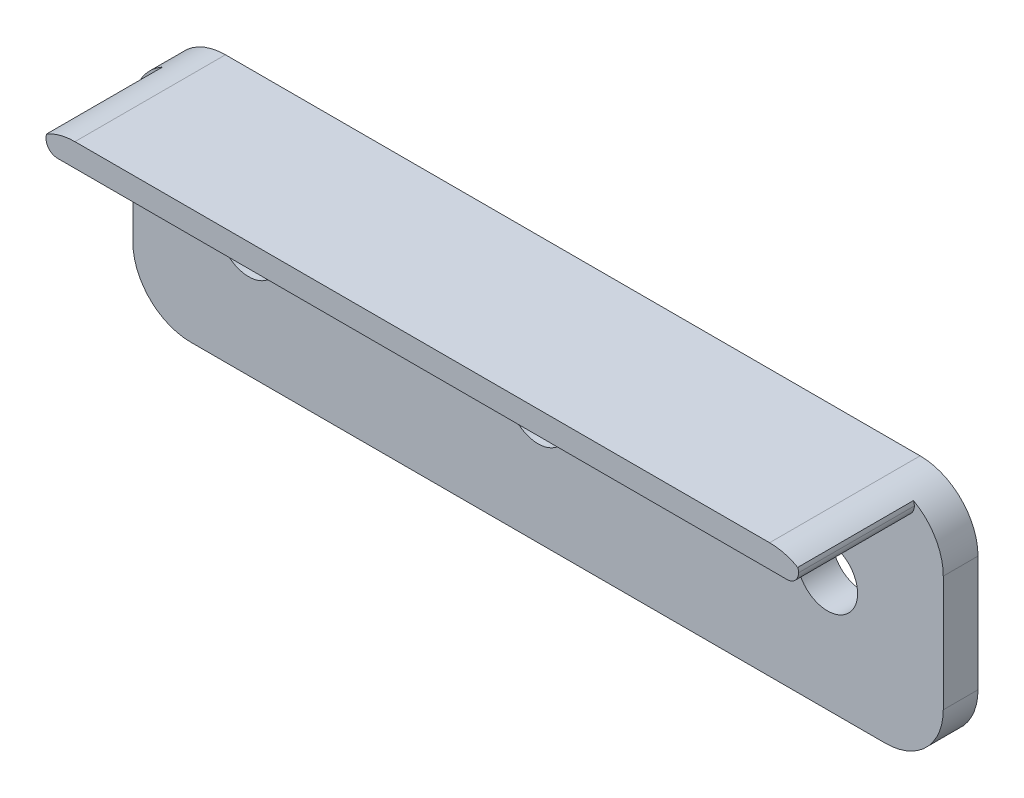
ISO-10303-21;
HEADER;
FILE_DESCRIPTION(('STEP AP214'),'2;1');
FILE_NAME('part.step','',(''),(''),'','','');
FILE_SCHEMA(('AUTOMOTIVE_DESIGN { 1 0 10303 214 1 1 1 1 }'));
ENDSEC;
DATA;
#1=APPLICATION_CONTEXT('core data for automotive mechanical design processes');
#2=APPLICATION_PROTOCOL_DEFINITION('international standard','automotive_design',2000,#1);
#3=PRODUCT_CONTEXT('',#1,'mechanical');
#4=PRODUCT('Part','Part','',(#3));
#5=PRODUCT_RELATED_PRODUCT_CATEGORY('part','',(#4));
#6=PRODUCT_DEFINITION_FORMATION('','',#4);
#7=PRODUCT_DEFINITION_CONTEXT('part definition',#1,'design');
#8=PRODUCT_DEFINITION('design','',#6,#7);
#9=PRODUCT_DEFINITION_SHAPE('','',#8);
#10=(LENGTH_UNIT() NAMED_UNIT(*) SI_UNIT(.MILLI.,.METRE.));
#11=(NAMED_UNIT(*) PLANE_ANGLE_UNIT() SI_UNIT($,.RADIAN.));
#12=(NAMED_UNIT(*) SI_UNIT($,.STERADIAN.) SOLID_ANGLE_UNIT());
#13=UNCERTAINTY_MEASURE_WITH_UNIT(LENGTH_MEASURE(1.E-05),#10,'distance_accuracy_value','');
#14=(GEOMETRIC_REPRESENTATION_CONTEXT(3) GLOBAL_UNCERTAINTY_ASSIGNED_CONTEXT((#13)) GLOBAL_UNIT_ASSIGNED_CONTEXT((#10,
#11,#12)) REPRESENTATION_CONTEXT('',''));
#15=CARTESIAN_POINT('',(0.,0.,0.));
#16=DIRECTION('',(0.,0.,1.));
#17=DIRECTION('',(1.,0.,0.));
#18=AXIS2_PLACEMENT_3D('',#15,#16,#17);
#19=CARTESIAN_POINT('',(0.,0.,3.));
#20=DIRECTION('',(0.,0.,-1.));
#21=DIRECTION('',(-1.,0.,0.));
#22=AXIS2_PLACEMENT_3D('',#19,#20,#21);
#23=PLANE('',#22);
#24=CARTESIAN_POINT('',(0.,0.,3.));
#25=DIRECTION('',(0.,0.,1.));
#26=DIRECTION('',(1.,0.,0.));
#27=AXIS2_PLACEMENT_3D('',#24,#25,#26);
#28=CIRCLE('',#27,2.6);
#29=CARTESIAN_POINT('',(2.6,0.,3.));
#30=VERTEX_POINT('',#29);
#31=EDGE_CURVE('E318',#30,#30,#28,.T.);
#32=ORIENTED_EDGE('',*,*,#31,.F.);
#33=EDGE_LOOP('',(#32));
#34=FACE_BOUND('',#33,.T.);
#35=CARTESIAN_POINT('',(25.,0.,3.));
#36=DIRECTION('',(0.,0.,1.));
#37=DIRECTION('',(1.,0.,0.));
#38=AXIS2_PLACEMENT_3D('',#35,#36,#37);
#39=CIRCLE('',#38,2.6);
#40=CARTESIAN_POINT('',(27.6,0.,3.));
#41=VERTEX_POINT('',#40);
#42=EDGE_CURVE('E326',#41,#41,#39,.T.);
#43=ORIENTED_EDGE('',*,*,#42,.F.);
#44=EDGE_LOOP('',(#43));
#45=FACE_BOUND('',#44,.T.);
#46=CARTESIAN_POINT('',(-25.,0.,3.));
#47=DIRECTION('',(0.,0.,1.));
#48=DIRECTION('',(1.,0.,0.));
#49=AXIS2_PLACEMENT_3D('',#46,#47,#48);
#50=CIRCLE('',#49,2.6);
#51=CARTESIAN_POINT('',(-22.4,0.,3.));
#52=VERTEX_POINT('',#51);
#53=EDGE_CURVE('E263',#52,#52,#50,.T.);
#54=ORIENTED_EDGE('',*,*,#53,.F.);
#55=EDGE_LOOP('',(#54));
#56=FACE_BOUND('',#55,.T.);
#57=DIRECTION('',(0.,-1.,0.));
#58=VECTOR('',#57,1.);
#59=CARTESIAN_POINT('',(-35.,-10.,3.));
#60=LINE('',#59,#58);
#61=CARTESIAN_POINT('',(-35.,5.,3.));
#62=VERTEX_POINT('',#61);
#63=CARTESIAN_POINT('',(-35.,-5.,3.));
#64=VERTEX_POINT('',#63);
#65=EDGE_CURVE('E337',#62,#64,#60,.T.);
#66=ORIENTED_EDGE('',*,*,#65,.T.);
#67=CARTESIAN_POINT('',(-30.,-5.,3.));
#68=DIRECTION('',(0.,0.,-1.));
#69=DIRECTION('',(-1.,0.,0.));
#70=AXIS2_PLACEMENT_3D('',#67,#68,#69);
#71=CIRCLE('',#70,5.);
#72=CARTESIAN_POINT('',(-30.,-10.,3.));
#73=VERTEX_POINT('',#72);
#74=EDGE_CURVE('E221',#64,#73,#71,.F.);
#75=ORIENTED_EDGE('',*,*,#74,.T.);
#76=DIRECTION('',(1.,0.,0.));
#77=VECTOR('',#76,1.);
#78=CARTESIAN_POINT('',(-35.,-10.,3.));
#79=LINE('',#78,#77);
#80=CARTESIAN_POINT('',(30.,-10.,3.));
#81=VERTEX_POINT('',#80);
#82=EDGE_CURVE('E274',#73,#81,#79,.T.);
#83=ORIENTED_EDGE('',*,*,#82,.T.);
#84=CARTESIAN_POINT('',(30.,-5.,3.));
#85=DIRECTION('',(0.,0.,-1.));
#86=DIRECTION('',(-1.,0.,0.));
#87=AXIS2_PLACEMENT_3D('',#84,#85,#86);
#88=CIRCLE('',#87,5.);
#89=CARTESIAN_POINT('',(35.,-5.,3.));
#90=VERTEX_POINT('',#89);
#91=EDGE_CURVE('E215',#81,#90,#88,.F.);
#92=ORIENTED_EDGE('',*,*,#91,.T.);
#93=DIRECTION('',(0.,1.,0.));
#94=VECTOR('',#93,1.);
#95=CARTESIAN_POINT('',(35.,-10.,3.));
#96=LINE('',#95,#94);
#97=CARTESIAN_POINT('',(35.,5.,3.));
#98=VERTEX_POINT('',#97);
#99=EDGE_CURVE('E252',#90,#98,#96,.T.);
#100=ORIENTED_EDGE('',*,*,#99,.T.);
#101=CARTESIAN_POINT('',(30.,5.,3.));
#102=DIRECTION('',(0.,0.,-1.));
#103=DIRECTION('',(-1.,0.,0.));
#104=AXIS2_PLACEMENT_3D('',#101,#102,#103);
#105=CIRCLE('',#104,5.);
#106=CARTESIAN_POINT('',(32.4288616251925,9.3704268905528,3.));
#107=VERTEX_POINT('',#106);
#108=EDGE_CURVE('E212',#98,#107,#105,.F.);
#109=ORIENTED_EDGE('',*,*,#108,.T.);
#110=CARTESIAN_POINT('',(31.5,9.,3.));
#111=DIRECTION('',(0.,0.,-1.));
#112=DIRECTION('',(-1.,0.,0.));
#113=AXIS2_PLACEMENT_3D('',#110,#111,#112);
#114=CIRCLE('',#113,1.);
#115=CARTESIAN_POINT('',(32.5,9.00000000000001,3.));
#116=VERTEX_POINT('',#115);
#117=EDGE_CURVE('E296',#107,#116,#114,.T.);
#118=ORIENTED_EDGE('',*,*,#117,.T.);
#119=CARTESIAN_POINT('',(31.5,9.00000000000001,3.));
#120=DIRECTION('',(0.,0.,-1.));
#121=DIRECTION('',(-1.,0.,0.));
#122=AXIS2_PLACEMENT_3D('',#119,#120,#121);
#123=CIRCLE('',#122,1.);
#124=CARTESIAN_POINT('',(31.5,8.00000000000001,3.));
#125=VERTEX_POINT('',#124);
#126=EDGE_CURVE('E183',#116,#125,#123,.T.);
#127=ORIENTED_EDGE('',*,*,#126,.T.);
#128=DIRECTION('',(1.,0.,0.));
#129=VECTOR('',#128,1.);
#130=CARTESIAN_POINT('',(32.5,8.00000000000001,3.));
#131=LINE('',#130,#129);
#132=CARTESIAN_POINT('',(-31.5,8.00000000000001,3.));
#133=VERTEX_POINT('',#132);
#134=EDGE_CURVE('E172',#133,#125,#131,.T.);
#135=ORIENTED_EDGE('',*,*,#134,.F.);
#136=CARTESIAN_POINT('',(-31.5,9.00000000000001,3.));
#137=DIRECTION('',(0.,0.,-1.));
#138=DIRECTION('',(-1.,0.,0.));
#139=AXIS2_PLACEMENT_3D('',#136,#137,#138);
#140=CIRCLE('',#139,1.);
#141=CARTESIAN_POINT('',(-32.5,9.,3.));
#142=VERTEX_POINT('',#141);
#143=EDGE_CURVE('E294',#133,#142,#140,.T.);
#144=ORIENTED_EDGE('',*,*,#143,.T.);
#145=CARTESIAN_POINT('',(-31.5,9.,3.));
#146=DIRECTION('',(0.,0.,-1.));
#147=DIRECTION('',(-1.,0.,0.));
#148=AXIS2_PLACEMENT_3D('',#145,#146,#147);
#149=CIRCLE('',#148,1.);
#150=CARTESIAN_POINT('',(-32.4288616251926,9.37042689055275,3.));
#151=VERTEX_POINT('',#150);
#152=EDGE_CURVE('E170',#142,#151,#149,.T.);
#153=ORIENTED_EDGE('',*,*,#152,.T.);
#154=CARTESIAN_POINT('',(-30.,5.,3.));
#155=DIRECTION('',(0.,0.,-1.));
#156=DIRECTION('',(-1.,0.,0.));
#157=AXIS2_PLACEMENT_3D('',#154,#155,#156);
#158=CIRCLE('',#157,5.);
#159=EDGE_CURVE('E218',#151,#62,#158,.F.);
#160=ORIENTED_EDGE('',*,*,#159,.T.);
#161=EDGE_LOOP('',(#66,#75,#83,#92,#100,#109,#118,#127,#135,#144,#153,#160));
#162=FACE_BOUND('',#161,.T.);
#163=ADVANCED_FACE('F45',(#34,#45,#56,#162),#23,.F.);
#164=CARTESIAN_POINT('',(0.,0.,0.));
#165=DIRECTION('',(0.,0.,-1.));
#166=DIRECTION('',(-1.,0.,0.));
#167=AXIS2_PLACEMENT_3D('',#164,#165,#166);
#168=PLANE('',#167);
#169=CARTESIAN_POINT('',(25.,0.,0.));
#170=DIRECTION('',(0.,0.,1.));
#171=DIRECTION('',(1.,0.,0.));
#172=AXIS2_PLACEMENT_3D('',#169,#170,#171);
#173=CIRCLE('',#172,2.6);
#174=CARTESIAN_POINT('',(27.6,0.,0.));
#175=VERTEX_POINT('',#174);
#176=EDGE_CURVE('E322',#175,#175,#173,.T.);
#177=ORIENTED_EDGE('',*,*,#176,.T.);
#178=EDGE_LOOP('',(#177));
#179=FACE_BOUND('',#178,.T.);
#180=DIRECTION('',(1.,0.,0.));
#181=VECTOR('',#180,1.);
#182=CARTESIAN_POINT('',(-35.,-10.,0.));
#183=LINE('',#182,#181);
#184=CARTESIAN_POINT('',(-30.,-10.,0.));
#185=VERTEX_POINT('',#184);
#186=CARTESIAN_POINT('',(30.,-10.,0.));
#187=VERTEX_POINT('',#186);
#188=EDGE_CURVE('E280',#185,#187,#183,.T.);
#189=ORIENTED_EDGE('',*,*,#188,.F.);
#190=CARTESIAN_POINT('',(-30.,-5.,0.));
#191=DIRECTION('',(0.,0.,-1.));
#192=DIRECTION('',(-1.,0.,0.));
#193=AXIS2_PLACEMENT_3D('',#190,#191,#192);
#194=CIRCLE('',#193,5.);
#195=CARTESIAN_POINT('',(-35.,-5.,0.));
#196=VERTEX_POINT('',#195);
#197=EDGE_CURVE('E202',#185,#196,#194,.T.);
#198=ORIENTED_EDGE('',*,*,#197,.T.);
#199=DIRECTION('',(0.,-1.,0.));
#200=VECTOR('',#199,1.);
#201=CARTESIAN_POINT('',(-35.,-10.,0.));
#202=LINE('',#201,#200);
#203=CARTESIAN_POINT('',(-35.,5.,0.));
#204=VERTEX_POINT('',#203);
#205=EDGE_CURVE('E268',#204,#196,#202,.T.);
#206=ORIENTED_EDGE('',*,*,#205,.F.);
#207=CARTESIAN_POINT('',(-30.,5.,0.));
#208=DIRECTION('',(0.,0.,-1.));
#209=DIRECTION('',(-1.,0.,0.));
#210=AXIS2_PLACEMENT_3D('',#207,#208,#209);
#211=CIRCLE('',#210,5.);
#212=CARTESIAN_POINT('',(-30.,10.,0.));
#213=VERTEX_POINT('',#212);
#214=EDGE_CURVE('E199',#204,#213,#211,.T.);
#215=ORIENTED_EDGE('',*,*,#214,.T.);
#216=DIRECTION('',(-1.,0.,0.));
#217=VECTOR('',#216,1.);
#218=CARTESIAN_POINT('',(-35.,10.,0.));
#219=LINE('',#218,#217);
#220=CARTESIAN_POINT('',(30.,10.,0.));
#221=VERTEX_POINT('',#220);
#222=EDGE_CURVE('E262',#221,#213,#219,.T.);
#223=ORIENTED_EDGE('',*,*,#222,.F.);
#224=CARTESIAN_POINT('',(30.,5.,0.));
#225=DIRECTION('',(0.,0.,-1.));
#226=DIRECTION('',(-1.,0.,0.));
#227=AXIS2_PLACEMENT_3D('',#224,#225,#226);
#228=CIRCLE('',#227,5.);
#229=CARTESIAN_POINT('',(35.,5.,0.));
#230=VERTEX_POINT('',#229);
#231=EDGE_CURVE('E193',#221,#230,#228,.T.);
#232=ORIENTED_EDGE('',*,*,#231,.T.);
#233=DIRECTION('',(0.,1.,0.));
#234=VECTOR('',#233,1.);
#235=CARTESIAN_POINT('',(35.,-10.,0.));
#236=LINE('',#235,#234);
#237=CARTESIAN_POINT('',(35.,-5.,0.));
#238=VERTEX_POINT('',#237);
#239=EDGE_CURVE('E249',#238,#230,#236,.T.);
#240=ORIENTED_EDGE('',*,*,#239,.F.);
#241=CARTESIAN_POINT('',(30.,-5.,0.));
#242=DIRECTION('',(0.,0.,-1.));
#243=DIRECTION('',(-1.,0.,0.));
#244=AXIS2_PLACEMENT_3D('',#241,#242,#243);
#245=CIRCLE('',#244,5.);
#246=EDGE_CURVE('E196',#238,#187,#245,.T.);
#247=ORIENTED_EDGE('',*,*,#246,.T.);
#248=EDGE_LOOP('',(#189,#198,#206,#215,#223,#232,#240,#247));
#249=FACE_BOUND('',#248,.T.);
#250=CARTESIAN_POINT('',(-25.,0.,0.));
#251=DIRECTION('',(0.,0.,1.));
#252=DIRECTION('',(1.,0.,0.));
#253=AXIS2_PLACEMENT_3D('',#250,#251,#252);
#254=CIRCLE('',#253,2.6);
#255=CARTESIAN_POINT('',(-22.4,0.,0.));
#256=VERTEX_POINT('',#255);
#257=EDGE_CURVE('E271',#256,#256,#254,.T.);
#258=ORIENTED_EDGE('',*,*,#257,.T.);
#259=EDGE_LOOP('',(#258));
#260=FACE_BOUND('',#259,.T.);
#261=CARTESIAN_POINT('',(0.,0.,0.));
#262=DIRECTION('',(0.,0.,1.));
#263=DIRECTION('',(1.,0.,0.));
#264=AXIS2_PLACEMENT_3D('',#261,#262,#263);
#265=CIRCLE('',#264,2.6);
#266=CARTESIAN_POINT('',(2.6,0.,0.));
#267=VERTEX_POINT('',#266);
#268=EDGE_CURVE('E315',#267,#267,#265,.T.);
#269=ORIENTED_EDGE('',*,*,#268,.T.);
#270=EDGE_LOOP('',(#269));
#271=FACE_BOUND('',#270,.T.);
#272=ADVANCED_FACE('F257',(#179,#249,#260,#271),#168,.T.);
#273=CARTESIAN_POINT('',(35.,-10.,3.));
#274=DIRECTION('',(-1.,0.,0.));
#275=DIRECTION('',(0.,0.,1.));
#276=AXIS2_PLACEMENT_3D('',#273,#274,#275);
#277=PLANE('',#276);
#278=ORIENTED_EDGE('',*,*,#99,.F.);
#279=DIRECTION('',(0.,0.,-1.));
#280=VECTOR('',#279,1.);
#281=CARTESIAN_POINT('',(35.,-5.,3.));
#282=LINE('',#281,#280);
#283=EDGE_CURVE('E54',#90,#238,#282,.T.);
#284=ORIENTED_EDGE('',*,*,#283,.T.);
#285=ORIENTED_EDGE('',*,*,#239,.T.);
#286=DIRECTION('',(0.,0.,-1.));
#287=VECTOR('',#286,1.);
#288=CARTESIAN_POINT('',(35.,5.,3.));
#289=LINE('',#288,#287);
#290=EDGE_CURVE('E239',#230,#98,#289,.F.);
#291=ORIENTED_EDGE('',*,*,#290,.T.);
#292=EDGE_LOOP('',(#278,#284,#285,#291));
#293=FACE_BOUND('',#292,.T.);
#294=ADVANCED_FACE('F248',(#293),#277,.F.);
#295=CARTESIAN_POINT('',(-35.,10.,3.));
#296=DIRECTION('',(0.,-1.,0.));
#297=DIRECTION('',(0.,0.,-1.));
#298=AXIS2_PLACEMENT_3D('',#295,#296,#297);
#299=PLANE('',#298);
#300=ORIENTED_EDGE('',*,*,#222,.T.);
#301=DIRECTION('',(0.,0.,-1.));
#302=VECTOR('',#301,1.);
#303=CARTESIAN_POINT('',(-30.,10.,3.));
#304=LINE('',#303,#302);
#305=CARTESIAN_POINT('',(-30.,10.,13.));
#306=VERTEX_POINT('',#305);
#307=EDGE_CURVE('E228',#213,#306,#304,.F.);
#308=ORIENTED_EDGE('',*,*,#307,.T.);
#309=DIRECTION('',(-1.,0.,0.));
#310=VECTOR('',#309,1.);
#311=CARTESIAN_POINT('',(32.5,10.,13.));
#312=LINE('',#311,#310);
#313=CARTESIAN_POINT('',(30.,10.,13.));
#314=VERTEX_POINT('',#313);
#315=EDGE_CURVE('E312',#314,#306,#312,.T.);
#316=ORIENTED_EDGE('',*,*,#315,.F.);
#317=DIRECTION('',(0.,0.,-1.));
#318=VECTOR('',#317,1.);
#319=CARTESIAN_POINT('',(30.,10.,3.));
#320=LINE('',#319,#318);
#321=EDGE_CURVE('E224',#314,#221,#320,.T.);
#322=ORIENTED_EDGE('',*,*,#321,.T.);
#323=EDGE_LOOP('',(#300,#308,#316,#322));
#324=FACE_BOUND('',#323,.T.);
#325=ADVANCED_FACE('F387',(#324),#299,.F.);
#326=CARTESIAN_POINT('',(-35.,-10.,3.));
#327=DIRECTION('',(1.,0.,0.));
#328=DIRECTION('',(0.,0.,-1.));
#329=AXIS2_PLACEMENT_3D('',#326,#327,#328);
#330=PLANE('',#329);
#331=ORIENTED_EDGE('',*,*,#205,.T.);
#332=DIRECTION('',(0.,0.,-1.));
#333=VECTOR('',#332,1.);
#334=CARTESIAN_POINT('',(-35.,-5.,3.));
#335=LINE('',#334,#333);
#336=EDGE_CURVE('E209',#196,#64,#335,.F.);
#337=ORIENTED_EDGE('',*,*,#336,.T.);
#338=ORIENTED_EDGE('',*,*,#65,.F.);
#339=DIRECTION('',(0.,0.,-1.));
#340=VECTOR('',#339,1.);
#341=CARTESIAN_POINT('',(-35.,5.,3.));
#342=LINE('',#341,#340);
#343=EDGE_CURVE('E205',#62,#204,#342,.T.);
#344=ORIENTED_EDGE('',*,*,#343,.T.);
#345=EDGE_LOOP('',(#331,#337,#338,#344));
#346=FACE_BOUND('',#345,.T.);
#347=ADVANCED_FACE('F353',(#346),#330,.F.);
#348=CARTESIAN_POINT('',(-35.,-10.,3.));
#349=DIRECTION('',(0.,1.,0.));
#350=DIRECTION('',(0.,0.,1.));
#351=AXIS2_PLACEMENT_3D('',#348,#349,#350);
#352=PLANE('',#351);
#353=ORIENTED_EDGE('',*,*,#82,.F.);
#354=DIRECTION('',(0.,0.,-1.));
#355=VECTOR('',#354,1.);
#356=CARTESIAN_POINT('',(-30.,-10.,3.));
#357=LINE('',#356,#355);
#358=EDGE_CURVE('E189',#73,#185,#357,.T.);
#359=ORIENTED_EDGE('',*,*,#358,.T.);
#360=ORIENTED_EDGE('',*,*,#188,.T.);
#361=DIRECTION('',(0.,0.,-1.));
#362=VECTOR('',#361,1.);
#363=CARTESIAN_POINT('',(30.,-10.,3.));
#364=LINE('',#363,#362);
#365=EDGE_CURVE('E186',#187,#81,#364,.F.);
#366=ORIENTED_EDGE('',*,*,#365,.T.);
#367=EDGE_LOOP('',(#353,#359,#360,#366));
#368=FACE_BOUND('',#367,.T.);
#369=ADVANCED_FACE('F348',(#368),#352,.F.);
#370=CARTESIAN_POINT('',(-25.,0.,3.));
#371=DIRECTION('',(0.,0.,-1.));
#372=DIRECTION('',(-1.,0.,0.));
#373=AXIS2_PLACEMENT_3D('',#370,#371,#372);
#374=CYLINDRICAL_SURFACE('',#373,2.6);
#375=ORIENTED_EDGE('',*,*,#53,.T.);
#376=EDGE_LOOP('',(#375));
#377=FACE_BOUND('',#376,.T.);
#378=ORIENTED_EDGE('',*,*,#257,.F.);
#379=EDGE_LOOP('',(#378));
#380=FACE_BOUND('',#379,.T.);
#381=ADVANCED_FACE('F380',(#377,#380),#374,.F.);
#382=CARTESIAN_POINT('',(25.,0.,3.));
#383=DIRECTION('',(0.,0.,-1.));
#384=DIRECTION('',(-1.,0.,0.));
#385=AXIS2_PLACEMENT_3D('',#382,#383,#384);
#386=CYLINDRICAL_SURFACE('',#385,2.6);
#387=ORIENTED_EDGE('',*,*,#42,.T.);
#388=EDGE_LOOP('',(#387));
#389=FACE_BOUND('',#388,.T.);
#390=ORIENTED_EDGE('',*,*,#176,.F.);
#391=EDGE_LOOP('',(#390));
#392=FACE_BOUND('',#391,.T.);
#393=ADVANCED_FACE('F422',(#389,#392),#386,.F.);
#394=CARTESIAN_POINT('',(0.,0.,3.));
#395=DIRECTION('',(0.,0.,-1.));
#396=DIRECTION('',(-1.,0.,0.));
#397=AXIS2_PLACEMENT_3D('',#394,#395,#396);
#398=CYLINDRICAL_SURFACE('',#397,2.6);
#399=ORIENTED_EDGE('',*,*,#31,.T.);
#400=EDGE_LOOP('',(#399));
#401=FACE_BOUND('',#400,.T.);
#402=ORIENTED_EDGE('',*,*,#268,.F.);
#403=EDGE_LOOP('',(#402));
#404=FACE_BOUND('',#403,.T.);
#405=ADVANCED_FACE('F413',(#401,#404),#398,.F.);
#406=CARTESIAN_POINT('',(32.5,8.00000000000001,13.));
#407=DIRECTION('',(0.,1.,0.));
#408=DIRECTION('',(-1.,0.,0.));
#409=AXIS2_PLACEMENT_3D('',#406,#407,#408);
#410=PLANE('',#409);
#411=DIRECTION('',(1.,0.,0.));
#412=VECTOR('',#411,1.);
#413=CARTESIAN_POINT('',(32.5,8.00000000000001,13.));
#414=LINE('',#413,#412);
#415=CARTESIAN_POINT('',(-31.5,8.00000000000001,13.));
#416=VERTEX_POINT('',#415);
#417=CARTESIAN_POINT('',(31.5,8.00000000000001,13.));
#418=VERTEX_POINT('',#417);
#419=EDGE_CURVE('E178',#416,#418,#414,.T.);
#420=ORIENTED_EDGE('',*,*,#419,.F.);
#421=DIRECTION('',(0.,0.,-1.));
#422=VECTOR('',#421,1.);
#423=CARTESIAN_POINT('',(-31.5,8.00000000000001,13.));
#424=LINE('',#423,#422);
#425=EDGE_CURVE('E164',#416,#133,#424,.T.);
#426=ORIENTED_EDGE('',*,*,#425,.T.);
#427=ORIENTED_EDGE('',*,*,#134,.T.);
#428=DIRECTION('',(0.,0.,-1.));
#429=VECTOR('',#428,1.);
#430=CARTESIAN_POINT('',(31.5,8.00000000000001,13.));
#431=LINE('',#430,#429);
#432=EDGE_CURVE('E155',#125,#418,#431,.F.);
#433=ORIENTED_EDGE('',*,*,#432,.T.);
#434=EDGE_LOOP('',(#420,#426,#427,#433));
#435=FACE_BOUND('',#434,.T.);
#436=ADVANCED_FACE('F307',(#435),#410,.F.);
#437=CARTESIAN_POINT('',(0.,0.,13.));
#438=DIRECTION('',(0.,0.,1.));
#439=DIRECTION('',(1.,0.,0.));
#440=AXIS2_PLACEMENT_3D('',#437,#438,#439);
#441=PLANE('',#440);
#442=ORIENTED_EDGE('',*,*,#315,.T.);
#443=CARTESIAN_POINT('',(-30.,5.,13.));
#444=DIRECTION('',(0.,0.,1.));
#445=DIRECTION('',(1.,0.,0.));
#446=AXIS2_PLACEMENT_3D('',#443,#444,#445);
#447=CIRCLE('',#446,5.);
#448=CARTESIAN_POINT('',(-32.4288616251926,9.37042689055275,13.));
#449=VERTEX_POINT('',#448);
#450=EDGE_CURVE('E67',#306,#449,#447,.T.);
#451=ORIENTED_EDGE('',*,*,#450,.T.);
#452=CARTESIAN_POINT('',(-31.5,9.,13.));
#453=DIRECTION('',(0.,0.,1.));
#454=DIRECTION('',(1.,0.,0.));
#455=AXIS2_PLACEMENT_3D('',#452,#453,#454);
#456=CIRCLE('',#455,1.);
#457=CARTESIAN_POINT('',(-32.5,9.00000000000001,13.));
#458=VERTEX_POINT('',#457);
#459=EDGE_CURVE('E145',#449,#458,#456,.T.);
#460=ORIENTED_EDGE('',*,*,#459,.T.);
#461=CARTESIAN_POINT('',(-31.5,9.00000000000001,13.));
#462=DIRECTION('',(0.,0.,1.));
#463=DIRECTION('',(1.,0.,0.));
#464=AXIS2_PLACEMENT_3D('',#461,#462,#463);
#465=CIRCLE('',#464,1.);
#466=EDGE_CURVE('E149',#458,#416,#465,.T.);
#467=ORIENTED_EDGE('',*,*,#466,.T.);
#468=ORIENTED_EDGE('',*,*,#419,.T.);
#469=CARTESIAN_POINT('',(31.5,9.00000000000001,13.));
#470=DIRECTION('',(0.,0.,1.));
#471=DIRECTION('',(1.,0.,0.));
#472=AXIS2_PLACEMENT_3D('',#469,#470,#471);
#473=CIRCLE('',#472,1.);
#474=CARTESIAN_POINT('',(32.5,9.00000000000002,13.));
#475=VERTEX_POINT('',#474);
#476=EDGE_CURVE('E283',#418,#475,#473,.T.);
#477=ORIENTED_EDGE('',*,*,#476,.T.);
#478=CARTESIAN_POINT('',(31.5,9.,13.));
#479=DIRECTION('',(0.,0.,1.));
#480=DIRECTION('',(1.,0.,0.));
#481=AXIS2_PLACEMENT_3D('',#478,#479,#480);
#482=CIRCLE('',#481,1.);
#483=CARTESIAN_POINT('',(32.4288616251925,9.3704268905528,13.));
#484=VERTEX_POINT('',#483);
#485=EDGE_CURVE('E166',#475,#484,#482,.T.);
#486=ORIENTED_EDGE('',*,*,#485,.T.);
#487=CARTESIAN_POINT('',(30.,5.,13.));
#488=DIRECTION('',(0.,0.,1.));
#489=DIRECTION('',(1.,0.,0.));
#490=AXIS2_PLACEMENT_3D('',#487,#488,#489);
#491=CIRCLE('',#490,5.);
#492=EDGE_CURVE('E231',#484,#314,#491,.T.);
#493=ORIENTED_EDGE('',*,*,#492,.T.);
#494=EDGE_LOOP('',(#442,#451,#460,#467,#468,#477,#486,#493));
#495=FACE_BOUND('',#494,.T.);
#496=ADVANCED_FACE('F147',(#495),#441,.T.);
#497=CARTESIAN_POINT('',(-31.5,9.00000000000001,13.));
#498=DIRECTION('',(0.,0.,-1.));
#499=DIRECTION('',(-1.,0.,0.));
#500=AXIS2_PLACEMENT_3D('',#497,#498,#499);
#501=CYLINDRICAL_SURFACE('',#500,1.);
#502=ORIENTED_EDGE('',*,*,#425,.F.);
#503=ORIENTED_EDGE('',*,*,#466,.F.);
#504=DIRECTION('',(0.,0.,-1.));
#505=VECTOR('',#504,1.);
#506=CARTESIAN_POINT('',(-32.5,9.00000000000001,13.));
#507=LINE('',#506,#505);
#508=EDGE_CURVE('E162',#142,#458,#507,.F.);
#509=ORIENTED_EDGE('',*,*,#508,.F.);
#510=ORIENTED_EDGE('',*,*,#143,.F.);
#511=EDGE_LOOP('',(#502,#503,#509,#510));
#512=FACE_BOUND('',#511,.T.);
#513=ADVANCED_FACE('F160',(#512),#501,.T.);
#514=CARTESIAN_POINT('',(-31.5,9.,13.));
#515=DIRECTION('',(0.,0.,-1.));
#516=DIRECTION('',(-1.,0.,0.));
#517=AXIS2_PLACEMENT_3D('',#514,#515,#516);
#518=CYLINDRICAL_SURFACE('',#517,1.);
#519=ORIENTED_EDGE('',*,*,#459,.F.);
#520=DIRECTION('',(0.,0.,-1.));
#521=VECTOR('',#520,1.);
#522=CARTESIAN_POINT('',(-32.4288616251926,9.37042689055275,13.));
#523=LINE('',#522,#521);
#524=EDGE_CURVE('E236',#449,#151,#523,.T.);
#525=ORIENTED_EDGE('',*,*,#524,.T.);
#526=ORIENTED_EDGE('',*,*,#152,.F.);
#527=ORIENTED_EDGE('',*,*,#508,.T.);
#528=EDGE_LOOP('',(#519,#525,#526,#527));
#529=FACE_BOUND('',#528,.T.);
#530=ADVANCED_FACE('F168',(#529),#518,.T.);
#531=CARTESIAN_POINT('',(31.5,9.00000000000001,13.));
#532=DIRECTION('',(0.,0.,-1.));
#533=DIRECTION('',(-1.,0.,0.));
#534=AXIS2_PLACEMENT_3D('',#531,#532,#533);
#535=CYLINDRICAL_SURFACE('',#534,1.);
#536=DIRECTION('',(0.,0.,-1.));
#537=VECTOR('',#536,1.);
#538=CARTESIAN_POINT('',(32.5,9.00000000000002,13.));
#539=LINE('',#538,#537);
#540=EDGE_CURVE('E173',#475,#116,#539,.T.);
#541=ORIENTED_EDGE('',*,*,#540,.F.);
#542=ORIENTED_EDGE('',*,*,#476,.F.);
#543=ORIENTED_EDGE('',*,*,#432,.F.);
#544=ORIENTED_EDGE('',*,*,#126,.F.);
#545=EDGE_LOOP('',(#541,#542,#543,#544));
#546=FACE_BOUND('',#545,.T.);
#547=ADVANCED_FACE('F309',(#546),#535,.T.);
#548=CARTESIAN_POINT('',(31.5,9.,3.));
#549=DIRECTION('',(0.,0.,-1.));
#550=DIRECTION('',(-1.,0.,0.));
#551=AXIS2_PLACEMENT_3D('',#548,#549,#550);
#552=CYLINDRICAL_SURFACE('',#551,1.);
#553=ORIENTED_EDGE('',*,*,#117,.F.);
#554=DIRECTION('',(0.,0.,-1.));
#555=VECTOR('',#554,1.);
#556=CARTESIAN_POINT('',(32.4288616251925,9.3704268905528,3.));
#557=LINE('',#556,#555);
#558=EDGE_CURVE('E11',#107,#484,#557,.F.);
#559=ORIENTED_EDGE('',*,*,#558,.T.);
#560=ORIENTED_EDGE('',*,*,#485,.F.);
#561=ORIENTED_EDGE('',*,*,#540,.T.);
#562=EDGE_LOOP('',(#553,#559,#560,#561));
#563=FACE_BOUND('',#562,.T.);
#564=ADVANCED_FACE('F358',(#563),#552,.T.);
#565=CARTESIAN_POINT('',(-30.,-5.,3.));
#566=DIRECTION('',(0.,0.,-1.));
#567=DIRECTION('',(-1.,0.,0.));
#568=AXIS2_PLACEMENT_3D('',#565,#566,#567);
#569=CYLINDRICAL_SURFACE('',#568,5.);
#570=ORIENTED_EDGE('',*,*,#74,.F.);
#571=ORIENTED_EDGE('',*,*,#336,.F.);
#572=ORIENTED_EDGE('',*,*,#197,.F.);
#573=ORIENTED_EDGE('',*,*,#358,.F.);
#574=EDGE_LOOP('',(#570,#571,#572,#573));
#575=FACE_BOUND('',#574,.T.);
#576=ADVANCED_FACE('F355',(#575),#569,.T.);
#577=CARTESIAN_POINT('',(-30.,5.,3.));
#578=DIRECTION('',(0.,0.,-1.));
#579=DIRECTION('',(-1.,0.,0.));
#580=AXIS2_PLACEMENT_3D('',#577,#578,#579);
#581=CYLINDRICAL_SURFACE('',#580,5.);
#582=ORIENTED_EDGE('',*,*,#450,.F.);
#583=ORIENTED_EDGE('',*,*,#307,.F.);
#584=ORIENTED_EDGE('',*,*,#214,.F.);
#585=ORIENTED_EDGE('',*,*,#343,.F.);
#586=ORIENTED_EDGE('',*,*,#159,.F.);
#587=ORIENTED_EDGE('',*,*,#524,.F.);
#588=EDGE_LOOP('',(#582,#583,#584,#585,#586,#587));
#589=FACE_BOUND('',#588,.T.);
#590=ADVANCED_FACE('F357',(#589),#581,.T.);
#591=CARTESIAN_POINT('',(30.,-5.,3.));
#592=DIRECTION('',(0.,0.,-1.));
#593=DIRECTION('',(-1.,0.,0.));
#594=AXIS2_PLACEMENT_3D('',#591,#592,#593);
#595=CYLINDRICAL_SURFACE('',#594,5.);
#596=ORIENTED_EDGE('',*,*,#91,.F.);
#597=ORIENTED_EDGE('',*,*,#365,.F.);
#598=ORIENTED_EDGE('',*,*,#246,.F.);
#599=ORIENTED_EDGE('',*,*,#283,.F.);
#600=EDGE_LOOP('',(#596,#597,#598,#599));
#601=FACE_BOUND('',#600,.T.);
#602=ADVANCED_FACE('F347',(#601),#595,.T.);
#603=CARTESIAN_POINT('',(30.,5.,3.));
#604=DIRECTION('',(0.,0.,-1.));
#605=DIRECTION('',(-1.,0.,0.));
#606=AXIS2_PLACEMENT_3D('',#603,#604,#605);
#607=CYLINDRICAL_SURFACE('',#606,5.);
#608=ORIENTED_EDGE('',*,*,#108,.F.);
#609=ORIENTED_EDGE('',*,*,#290,.F.);
#610=ORIENTED_EDGE('',*,*,#231,.F.);
#611=ORIENTED_EDGE('',*,*,#321,.F.);
#612=ORIENTED_EDGE('',*,*,#492,.F.);
#613=ORIENTED_EDGE('',*,*,#558,.F.);
#614=EDGE_LOOP('',(#608,#609,#610,#611,#612,#613));
#615=FACE_BOUND('',#614,.T.);
#616=ADVANCED_FACE('F47',(#615),#607,.T.);
#617=CLOSED_SHELL('',(#163,#272,#294,#325,#347,#369,#381,#393,#405,#436,#496,#513,#530,#547,
#564,#576,#590,#602,#616));
#618=MANIFOLD_SOLID_BREP('B2',#617);
#619=ADVANCED_BREP_SHAPE_REPRESENTATION('',(#18,#618),#14);
#620=SHAPE_DEFINITION_REPRESENTATION(#9,#619);
ENDSEC;
END-ISO-10303-21;
